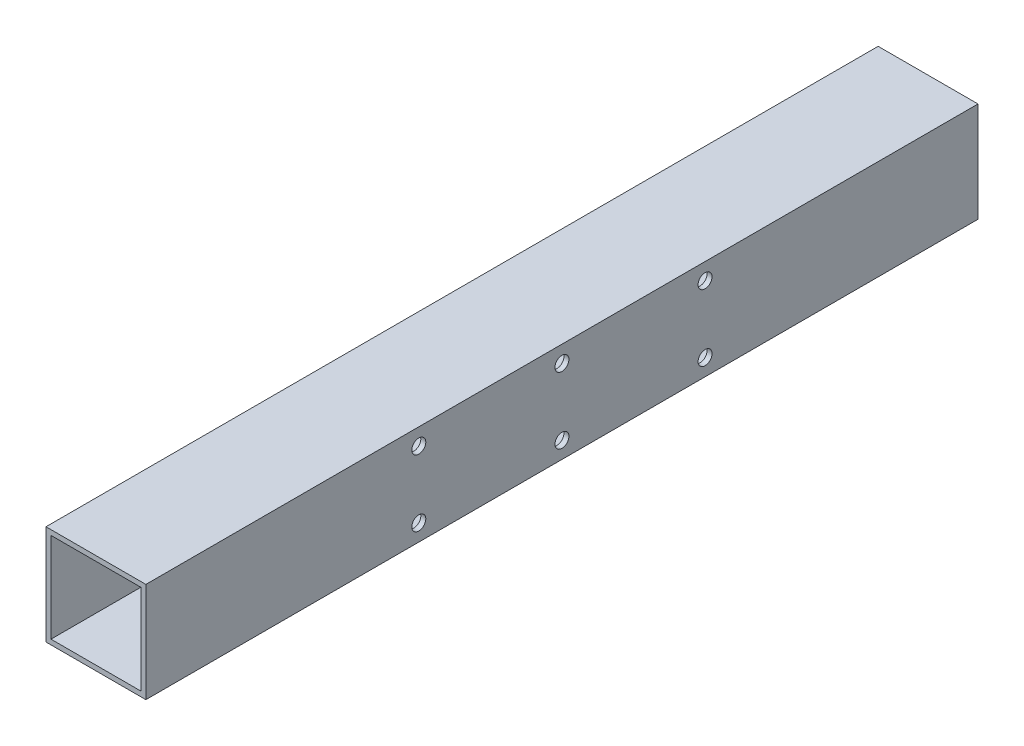
ISO-10303-21;
HEADER;
FILE_DESCRIPTION(('STEP AP214'),'2;1');
FILE_NAME('part.step','',(''),(''),'','','');
FILE_SCHEMA(('AUTOMOTIVE_DESIGN { 1 0 10303 214 1 1 1 1 }'));
ENDSEC;
DATA;
#1=APPLICATION_CONTEXT('core data for automotive mechanical design processes');
#2=APPLICATION_PROTOCOL_DEFINITION('international standard','automotive_design',2000,#1);
#3=PRODUCT_CONTEXT('',#1,'mechanical');
#4=PRODUCT('Part','Part','',(#3));
#5=PRODUCT_RELATED_PRODUCT_CATEGORY('part','',(#4));
#6=PRODUCT_DEFINITION_FORMATION('','',#4);
#7=PRODUCT_DEFINITION_CONTEXT('part definition',#1,'design');
#8=PRODUCT_DEFINITION('design','',#6,#7);
#9=PRODUCT_DEFINITION_SHAPE('','',#8);
#10=(LENGTH_UNIT() NAMED_UNIT(*) SI_UNIT(.MILLI.,.METRE.));
#11=(NAMED_UNIT(*) PLANE_ANGLE_UNIT() SI_UNIT($,.RADIAN.));
#12=(NAMED_UNIT(*) SI_UNIT($,.STERADIAN.) SOLID_ANGLE_UNIT());
#13=UNCERTAINTY_MEASURE_WITH_UNIT(LENGTH_MEASURE(1.E-05),#10,'distance_accuracy_value','');
#14=(GEOMETRIC_REPRESENTATION_CONTEXT(3) GLOBAL_UNCERTAINTY_ASSIGNED_CONTEXT((#13)) GLOBAL_UNIT_ASSIGNED_CONTEXT((#10,
#11,#12)) REPRESENTATION_CONTEXT('',''));
#15=CARTESIAN_POINT('',(0.,0.,0.));
#16=DIRECTION('',(0.,0.,1.));
#17=DIRECTION('',(1.,0.,0.));
#18=AXIS2_PLACEMENT_3D('',#15,#16,#17);
#19=CARTESIAN_POINT('',(0.,0.,250.));
#20=DIRECTION('',(0.,0.,-1.));
#21=DIRECTION('',(-1.,0.,0.));
#22=AXIS2_PLACEMENT_3D('',#19,#20,#21);
#23=PLANE('',#22);
#24=DIRECTION('',(0.,-1.,0.));
#25=VECTOR('',#24,1.);
#26=CARTESIAN_POINT('',(0.,0.,250.));
#27=LINE('',#26,#25);
#28=CARTESIAN_POINT('',(0.,30.,250.));
#29=VERTEX_POINT('',#28);
#30=CARTESIAN_POINT('',(0.,0.,250.));
#31=VERTEX_POINT('',#30);
#32=EDGE_CURVE('E150',#29,#31,#27,.T.);
#33=ORIENTED_EDGE('',*,*,#32,.T.);
#34=DIRECTION('',(1.,0.,0.));
#35=VECTOR('',#34,1.);
#36=CARTESIAN_POINT('',(0.,0.,250.));
#37=LINE('',#36,#35);
#38=CARTESIAN_POINT('',(30.,0.,250.));
#39=VERTEX_POINT('',#38);
#40=EDGE_CURVE('E153',#31,#39,#37,.T.);
#41=ORIENTED_EDGE('',*,*,#40,.T.);
#42=DIRECTION('',(0.,1.,0.));
#43=VECTOR('',#42,1.);
#44=CARTESIAN_POINT('',(30.,0.,250.));
#45=LINE('',#44,#43);
#46=CARTESIAN_POINT('',(30.,30.,250.));
#47=VERTEX_POINT('',#46);
#48=EDGE_CURVE('E156',#39,#47,#45,.T.);
#49=ORIENTED_EDGE('',*,*,#48,.T.);
#50=DIRECTION('',(-1.,0.,0.));
#51=VECTOR('',#50,1.);
#52=CARTESIAN_POINT('',(0.,30.,250.));
#53=LINE('',#52,#51);
#54=EDGE_CURVE('E158',#47,#29,#53,.T.);
#55=ORIENTED_EDGE('',*,*,#54,.T.);
#56=EDGE_LOOP('',(#33,#41,#49,#55));
#57=FACE_BOUND('',#56,.T.);
#58=DIRECTION('',(0.,-1.,0.));
#59=VECTOR('',#58,1.);
#60=CARTESIAN_POINT('',(1.5,1.5,250.));
#61=LINE('',#60,#59);
#62=CARTESIAN_POINT('',(1.5,28.5,250.));
#63=VERTEX_POINT('',#62);
#64=CARTESIAN_POINT('',(1.5,1.5,250.));
#65=VERTEX_POINT('',#64);
#66=EDGE_CURVE('E112',#63,#65,#61,.T.);
#67=ORIENTED_EDGE('',*,*,#66,.F.);
#68=DIRECTION('',(-1.,0.,0.));
#69=VECTOR('',#68,1.);
#70=CARTESIAN_POINT('',(1.5,28.5,250.));
#71=LINE('',#70,#69);
#72=CARTESIAN_POINT('',(28.5,28.5,250.));
#73=VERTEX_POINT('',#72);
#74=EDGE_CURVE('E134',#73,#63,#71,.T.);
#75=ORIENTED_EDGE('',*,*,#74,.F.);
#76=DIRECTION('',(0.,1.,0.));
#77=VECTOR('',#76,1.);
#78=CARTESIAN_POINT('',(28.5,1.5,250.));
#79=LINE('',#78,#77);
#80=CARTESIAN_POINT('',(28.5,1.5,250.));
#81=VERTEX_POINT('',#80);
#82=EDGE_CURVE('E132',#81,#73,#79,.T.);
#83=ORIENTED_EDGE('',*,*,#82,.F.);
#84=DIRECTION('',(1.,0.,0.));
#85=VECTOR('',#84,1.);
#86=CARTESIAN_POINT('',(1.5,1.5,250.));
#87=LINE('',#86,#85);
#88=EDGE_CURVE('E120',#65,#81,#87,.T.);
#89=ORIENTED_EDGE('',*,*,#88,.F.);
#90=EDGE_LOOP('',(#67,#75,#83,#89));
#91=FACE_BOUND('',#90,.T.);
#92=ADVANCED_FACE('F45',(#57,#91),#23,.F.);
#93=CARTESIAN_POINT('',(0.,0.,0.));
#94=DIRECTION('',(0.,0.,-1.));
#95=DIRECTION('',(-1.,0.,0.));
#96=AXIS2_PLACEMENT_3D('',#93,#94,#95);
#97=PLANE('',#96);
#98=DIRECTION('',(0.,-1.,0.));
#99=VECTOR('',#98,1.);
#100=CARTESIAN_POINT('',(0.,0.,0.));
#101=LINE('',#100,#99);
#102=CARTESIAN_POINT('',(0.,30.,0.));
#103=VERTEX_POINT('',#102);
#104=CARTESIAN_POINT('',(0.,0.,0.));
#105=VERTEX_POINT('',#104);
#106=EDGE_CURVE('E128',#103,#105,#101,.T.);
#107=ORIENTED_EDGE('',*,*,#106,.F.);
#108=DIRECTION('',(-1.,0.,0.));
#109=VECTOR('',#108,1.);
#110=CARTESIAN_POINT('',(0.,30.,0.));
#111=LINE('',#110,#109);
#112=CARTESIAN_POINT('',(30.,30.,0.));
#113=VERTEX_POINT('',#112);
#114=EDGE_CURVE('E154',#113,#103,#111,.T.);
#115=ORIENTED_EDGE('',*,*,#114,.F.);
#116=DIRECTION('',(0.,1.,0.));
#117=VECTOR('',#116,1.);
#118=CARTESIAN_POINT('',(30.,0.,0.));
#119=LINE('',#118,#117);
#120=CARTESIAN_POINT('',(30.,0.,0.));
#121=VERTEX_POINT('',#120);
#122=EDGE_CURVE('E165',#121,#113,#119,.T.);
#123=ORIENTED_EDGE('',*,*,#122,.F.);
#124=DIRECTION('',(1.,0.,0.));
#125=VECTOR('',#124,1.);
#126=CARTESIAN_POINT('',(0.,0.,0.));
#127=LINE('',#126,#125);
#128=EDGE_CURVE('E163',#105,#121,#127,.T.);
#129=ORIENTED_EDGE('',*,*,#128,.F.);
#130=EDGE_LOOP('',(#107,#115,#123,#129));
#131=FACE_BOUND('',#130,.T.);
#132=DIRECTION('',(-1.,0.,0.));
#133=VECTOR('',#132,1.);
#134=CARTESIAN_POINT('',(1.5,28.5,0.));
#135=LINE('',#134,#133);
#136=CARTESIAN_POINT('',(28.5,28.5,0.));
#137=VERTEX_POINT('',#136);
#138=CARTESIAN_POINT('',(1.5,28.5,0.));
#139=VERTEX_POINT('',#138);
#140=EDGE_CURVE('E121',#137,#139,#135,.T.);
#141=ORIENTED_EDGE('',*,*,#140,.T.);
#142=DIRECTION('',(0.,-1.,0.));
#143=VECTOR('',#142,1.);
#144=CARTESIAN_POINT('',(1.5,1.5,0.));
#145=LINE('',#144,#143);
#146=CARTESIAN_POINT('',(1.5,1.5,0.));
#147=VERTEX_POINT('',#146);
#148=EDGE_CURVE('E70',#139,#147,#145,.T.);
#149=ORIENTED_EDGE('',*,*,#148,.T.);
#150=DIRECTION('',(1.,0.,0.));
#151=VECTOR('',#150,1.);
#152=CARTESIAN_POINT('',(1.5,1.5,0.));
#153=LINE('',#152,#151);
#154=CARTESIAN_POINT('',(28.5,1.5,0.));
#155=VERTEX_POINT('',#154);
#156=EDGE_CURVE('E127',#147,#155,#153,.T.);
#157=ORIENTED_EDGE('',*,*,#156,.T.);
#158=DIRECTION('',(0.,1.,0.));
#159=VECTOR('',#158,1.);
#160=CARTESIAN_POINT('',(28.5,1.5,0.));
#161=LINE('',#160,#159);
#162=EDGE_CURVE('E142',#155,#137,#161,.T.);
#163=ORIENTED_EDGE('',*,*,#162,.T.);
#164=EDGE_LOOP('',(#141,#149,#157,#163));
#165=FACE_BOUND('',#164,.T.);
#166=ADVANCED_FACE('F229',(#131,#165),#97,.T.);
#167=CARTESIAN_POINT('',(0.,0.,250.));
#168=DIRECTION('',(1.,0.,0.));
#169=DIRECTION('',(0.,0.,-1.));
#170=AXIS2_PLACEMENT_3D('',#167,#168,#169);
#171=PLANE('',#170);
#172=CARTESIAN_POINT('',(0.,4.99999999999997,82.));
#173=DIRECTION('',(-1.,0.,0.));
#174=DIRECTION('',(0.,0.,1.));
#175=AXIS2_PLACEMENT_3D('',#172,#173,#174);
#176=CIRCLE('',#175,2.1);
#177=CARTESIAN_POINT('',(0.,4.99999999999997,84.1));
#178=VERTEX_POINT('',#177);
#179=EDGE_CURVE('E283',#178,#178,#176,.T.);
#180=ORIENTED_EDGE('',*,*,#179,.F.);
#181=EDGE_LOOP('',(#180));
#182=FACE_BOUND('',#181,.T.);
#183=CARTESIAN_POINT('',(0.,4.99999999999997,168.));
#184=DIRECTION('',(-1.,0.,0.));
#185=DIRECTION('',(0.,0.,1.));
#186=AXIS2_PLACEMENT_3D('',#183,#184,#185);
#187=CIRCLE('',#186,2.09999999999999);
#188=CARTESIAN_POINT('',(0.,4.99999999999997,170.1));
#189=VERTEX_POINT('',#188);
#190=EDGE_CURVE('E287',#189,#189,#187,.T.);
#191=ORIENTED_EDGE('',*,*,#190,.F.);
#192=EDGE_LOOP('',(#191));
#193=FACE_BOUND('',#192,.T.);
#194=CARTESIAN_POINT('',(0.,25.,168.));
#195=DIRECTION('',(-1.,0.,0.));
#196=DIRECTION('',(0.,0.,1.));
#197=AXIS2_PLACEMENT_3D('',#194,#195,#196);
#198=CIRCLE('',#197,2.09999999999999);
#199=CARTESIAN_POINT('',(0.,25.,170.1));
#200=VERTEX_POINT('',#199);
#201=EDGE_CURVE('E291',#200,#200,#198,.T.);
#202=ORIENTED_EDGE('',*,*,#201,.F.);
#203=EDGE_LOOP('',(#202));
#204=FACE_BOUND('',#203,.T.);
#205=CARTESIAN_POINT('',(0.,4.99999999999997,125.));
#206=DIRECTION('',(-1.,0.,0.));
#207=DIRECTION('',(0.,0.,1.));
#208=AXIS2_PLACEMENT_3D('',#205,#206,#207);
#209=CIRCLE('',#208,2.09999999999999);
#210=CARTESIAN_POINT('',(0.,4.99999999999997,127.1));
#211=VERTEX_POINT('',#210);
#212=EDGE_CURVE('E295',#211,#211,#209,.T.);
#213=ORIENTED_EDGE('',*,*,#212,.F.);
#214=EDGE_LOOP('',(#213));
#215=FACE_BOUND('',#214,.T.);
#216=CARTESIAN_POINT('',(0.,25.,82.));
#217=DIRECTION('',(-1.,0.,0.));
#218=DIRECTION('',(0.,0.,1.));
#219=AXIS2_PLACEMENT_3D('',#216,#217,#218);
#220=CIRCLE('',#219,2.1);
#221=CARTESIAN_POINT('',(0.,25.,84.1));
#222=VERTEX_POINT('',#221);
#223=EDGE_CURVE('E299',#222,#222,#220,.T.);
#224=ORIENTED_EDGE('',*,*,#223,.F.);
#225=EDGE_LOOP('',(#224));
#226=FACE_BOUND('',#225,.T.);
#227=CARTESIAN_POINT('',(0.,25.,125.));
#228=DIRECTION('',(-1.,0.,0.));
#229=DIRECTION('',(0.,0.,1.));
#230=AXIS2_PLACEMENT_3D('',#227,#228,#229);
#231=CIRCLE('',#230,2.09999999999999);
#232=CARTESIAN_POINT('',(0.,25.,127.1));
#233=VERTEX_POINT('',#232);
#234=EDGE_CURVE('E302',#233,#233,#231,.T.);
#235=ORIENTED_EDGE('',*,*,#234,.F.);
#236=EDGE_LOOP('',(#235));
#237=FACE_BOUND('',#236,.T.);
#238=ORIENTED_EDGE('',*,*,#106,.T.);
#239=DIRECTION('',(0.,0.,-1.));
#240=VECTOR('',#239,1.);
#241=CARTESIAN_POINT('',(0.,0.,250.));
#242=LINE('',#241,#240);
#243=EDGE_CURVE('E11',#31,#105,#242,.T.);
#244=ORIENTED_EDGE('',*,*,#243,.F.);
#245=ORIENTED_EDGE('',*,*,#32,.F.);
#246=DIRECTION('',(0.,0.,-1.));
#247=VECTOR('',#246,1.);
#248=CARTESIAN_POINT('',(0.,30.,250.));
#249=LINE('',#248,#247);
#250=EDGE_CURVE('E160',#29,#103,#249,.T.);
#251=ORIENTED_EDGE('',*,*,#250,.T.);
#252=EDGE_LOOP('',(#238,#244,#245,#251));
#253=FACE_BOUND('',#252,.T.);
#254=ADVANCED_FACE('F47',(#182,#193,#204,#215,#226,#237,#253),#171,.F.);
#255=CARTESIAN_POINT('',(0.,0.,250.));
#256=DIRECTION('',(0.,1.,0.));
#257=DIRECTION('',(0.,0.,1.));
#258=AXIS2_PLACEMENT_3D('',#255,#256,#257);
#259=PLANE('',#258);
#260=ORIENTED_EDGE('',*,*,#128,.T.);
#261=DIRECTION('',(0.,0.,-1.));
#262=VECTOR('',#261,1.);
#263=CARTESIAN_POINT('',(30.,0.,250.));
#264=LINE('',#263,#262);
#265=EDGE_CURVE('E54',#39,#121,#264,.T.);
#266=ORIENTED_EDGE('',*,*,#265,.F.);
#267=ORIENTED_EDGE('',*,*,#40,.F.);
#268=ORIENTED_EDGE('',*,*,#243,.T.);
#269=EDGE_LOOP('',(#260,#266,#267,#268));
#270=FACE_BOUND('',#269,.T.);
#271=ADVANCED_FACE('F259',(#270),#259,.F.);
#272=CARTESIAN_POINT('',(30.,0.,250.));
#273=DIRECTION('',(-1.,0.,0.));
#274=DIRECTION('',(0.,0.,1.));
#275=AXIS2_PLACEMENT_3D('',#272,#273,#274);
#276=PLANE('',#275);
#277=CARTESIAN_POINT('',(30.,4.99999999999997,82.));
#278=DIRECTION('',(-1.,0.,0.));
#279=DIRECTION('',(0.,0.,1.));
#280=AXIS2_PLACEMENT_3D('',#277,#278,#279);
#281=CIRCLE('',#280,2.1);
#282=CARTESIAN_POINT('',(30.,4.99999999999997,84.1));
#283=VERTEX_POINT('',#282);
#284=EDGE_CURVE('E355',#283,#283,#281,.T.);
#285=ORIENTED_EDGE('',*,*,#284,.T.);
#286=EDGE_LOOP('',(#285));
#287=FACE_BOUND('',#286,.T.);
#288=CARTESIAN_POINT('',(30.,4.99999999999997,168.));
#289=DIRECTION('',(-1.,0.,0.));
#290=DIRECTION('',(0.,0.,1.));
#291=AXIS2_PLACEMENT_3D('',#288,#289,#290);
#292=CIRCLE('',#291,2.09999999999999);
#293=CARTESIAN_POINT('',(30.,4.99999999999997,170.1));
#294=VERTEX_POINT('',#293);
#295=EDGE_CURVE('E360',#294,#294,#292,.T.);
#296=ORIENTED_EDGE('',*,*,#295,.T.);
#297=EDGE_LOOP('',(#296));
#298=FACE_BOUND('',#297,.T.);
#299=CARTESIAN_POINT('',(30.,25.,168.));
#300=DIRECTION('',(-1.,0.,0.));
#301=DIRECTION('',(0.,0.,1.));
#302=AXIS2_PLACEMENT_3D('',#299,#300,#301);
#303=CIRCLE('',#302,2.09999999999999);
#304=CARTESIAN_POINT('',(30.,25.,170.1));
#305=VERTEX_POINT('',#304);
#306=EDGE_CURVE('E359',#305,#305,#303,.T.);
#307=ORIENTED_EDGE('',*,*,#306,.T.);
#308=EDGE_LOOP('',(#307));
#309=FACE_BOUND('',#308,.T.);
#310=CARTESIAN_POINT('',(30.,4.99999999999997,125.));
#311=DIRECTION('',(-1.,0.,0.));
#312=DIRECTION('',(0.,0.,1.));
#313=AXIS2_PLACEMENT_3D('',#310,#311,#312);
#314=CIRCLE('',#313,2.09999999999999);
#315=CARTESIAN_POINT('',(30.,4.99999999999997,127.1));
#316=VERTEX_POINT('',#315);
#317=EDGE_CURVE('E307',#316,#316,#314,.T.);
#318=ORIENTED_EDGE('',*,*,#317,.T.);
#319=EDGE_LOOP('',(#318));
#320=FACE_BOUND('',#319,.T.);
#321=CARTESIAN_POINT('',(30.,25.,82.));
#322=DIRECTION('',(-1.,0.,0.));
#323=DIRECTION('',(0.,0.,1.));
#324=AXIS2_PLACEMENT_3D('',#321,#322,#323);
#325=CIRCLE('',#324,2.1);
#326=CARTESIAN_POINT('',(30.,25.,84.1));
#327=VERTEX_POINT('',#326);
#328=EDGE_CURVE('E352',#327,#327,#325,.T.);
#329=ORIENTED_EDGE('',*,*,#328,.T.);
#330=EDGE_LOOP('',(#329));
#331=FACE_BOUND('',#330,.T.);
#332=CARTESIAN_POINT('',(30.,25.,125.));
#333=DIRECTION('',(-1.,0.,0.));
#334=DIRECTION('',(0.,0.,1.));
#335=AXIS2_PLACEMENT_3D('',#332,#333,#334);
#336=CIRCLE('',#335,2.09999999999999);
#337=CARTESIAN_POINT('',(30.,25.,127.1));
#338=VERTEX_POINT('',#337);
#339=EDGE_CURVE('E179',#338,#338,#336,.T.);
#340=ORIENTED_EDGE('',*,*,#339,.T.);
#341=EDGE_LOOP('',(#340));
#342=FACE_BOUND('',#341,.T.);
#343=ORIENTED_EDGE('',*,*,#122,.T.);
#344=DIRECTION('',(0.,0.,-1.));
#345=VECTOR('',#344,1.);
#346=CARTESIAN_POINT('',(30.,30.,250.));
#347=LINE('',#346,#345);
#348=EDGE_CURVE('E170',#47,#113,#347,.T.);
#349=ORIENTED_EDGE('',*,*,#348,.F.);
#350=ORIENTED_EDGE('',*,*,#48,.F.);
#351=ORIENTED_EDGE('',*,*,#265,.T.);
#352=EDGE_LOOP('',(#343,#349,#350,#351));
#353=FACE_BOUND('',#352,.T.);
#354=ADVANCED_FACE('F256',(#287,#298,#309,#320,#331,#342,#353),#276,.F.);
#355=CARTESIAN_POINT('',(0.,30.,250.));
#356=DIRECTION('',(0.,-1.,0.));
#357=DIRECTION('',(0.,0.,-1.));
#358=AXIS2_PLACEMENT_3D('',#355,#356,#357);
#359=PLANE('',#358);
#360=ORIENTED_EDGE('',*,*,#114,.T.);
#361=ORIENTED_EDGE('',*,*,#250,.F.);
#362=ORIENTED_EDGE('',*,*,#54,.F.);
#363=ORIENTED_EDGE('',*,*,#348,.T.);
#364=EDGE_LOOP('',(#360,#361,#362,#363));
#365=FACE_BOUND('',#364,.T.);
#366=ADVANCED_FACE('F253',(#365),#359,.F.);
#367=CARTESIAN_POINT('',(1.5,1.5,250.));
#368=DIRECTION('',(1.,0.,0.));
#369=DIRECTION('',(0.,0.,-1.));
#370=AXIS2_PLACEMENT_3D('',#367,#368,#369);
#371=PLANE('',#370);
#372=CARTESIAN_POINT('',(1.5,4.99999999999997,82.));
#373=DIRECTION('',(1.,0.,0.));
#374=DIRECTION('',(0.,0.,-1.));
#375=AXIS2_PLACEMENT_3D('',#372,#373,#374);
#376=CIRCLE('',#375,2.1);
#377=CARTESIAN_POINT('',(1.5,4.99999999999997,79.9));
#378=VERTEX_POINT('',#377);
#379=EDGE_CURVE('E140',#378,#378,#376,.T.);
#380=ORIENTED_EDGE('',*,*,#379,.F.);
#381=EDGE_LOOP('',(#380));
#382=FACE_BOUND('',#381,.T.);
#383=CARTESIAN_POINT('',(1.5,4.99999999999997,168.));
#384=DIRECTION('',(1.,0.,0.));
#385=DIRECTION('',(0.,0.,-1.));
#386=AXIS2_PLACEMENT_3D('',#383,#384,#385);
#387=CIRCLE('',#386,2.09999999999999);
#388=CARTESIAN_POINT('',(1.5,4.99999999999997,165.9));
#389=VERTEX_POINT('',#388);
#390=EDGE_CURVE('E193',#389,#389,#387,.T.);
#391=ORIENTED_EDGE('',*,*,#390,.F.);
#392=EDGE_LOOP('',(#391));
#393=FACE_BOUND('',#392,.T.);
#394=CARTESIAN_POINT('',(1.5,25.,168.));
#395=DIRECTION('',(1.,0.,0.));
#396=DIRECTION('',(0.,0.,-1.));
#397=AXIS2_PLACEMENT_3D('',#394,#395,#396);
#398=CIRCLE('',#397,2.09999999999999);
#399=CARTESIAN_POINT('',(1.5,25.,165.9));
#400=VERTEX_POINT('',#399);
#401=EDGE_CURVE('E190',#400,#400,#398,.T.);
#402=ORIENTED_EDGE('',*,*,#401,.F.);
#403=EDGE_LOOP('',(#402));
#404=FACE_BOUND('',#403,.T.);
#405=CARTESIAN_POINT('',(1.5,4.99999999999997,125.));
#406=DIRECTION('',(1.,0.,0.));
#407=DIRECTION('',(0.,0.,-1.));
#408=AXIS2_PLACEMENT_3D('',#405,#406,#407);
#409=CIRCLE('',#408,2.09999999999999);
#410=CARTESIAN_POINT('',(1.5,4.99999999999997,122.9));
#411=VERTEX_POINT('',#410);
#412=EDGE_CURVE('E187',#411,#411,#409,.T.);
#413=ORIENTED_EDGE('',*,*,#412,.F.);
#414=EDGE_LOOP('',(#413));
#415=FACE_BOUND('',#414,.T.);
#416=CARTESIAN_POINT('',(1.5,25.,82.));
#417=DIRECTION('',(1.,0.,0.));
#418=DIRECTION('',(0.,0.,-1.));
#419=AXIS2_PLACEMENT_3D('',#416,#417,#418);
#420=CIRCLE('',#419,2.1);
#421=CARTESIAN_POINT('',(1.5,25.,79.9));
#422=VERTEX_POINT('',#421);
#423=EDGE_CURVE('E183',#422,#422,#420,.T.);
#424=ORIENTED_EDGE('',*,*,#423,.F.);
#425=EDGE_LOOP('',(#424));
#426=FACE_BOUND('',#425,.T.);
#427=CARTESIAN_POINT('',(1.5,25.,125.));
#428=DIRECTION('',(1.,0.,0.));
#429=DIRECTION('',(0.,0.,-1.));
#430=AXIS2_PLACEMENT_3D('',#427,#428,#429);
#431=CIRCLE('',#430,2.09999999999999);
#432=CARTESIAN_POINT('',(1.5,25.,122.9));
#433=VERTEX_POINT('',#432);
#434=EDGE_CURVE('E178',#433,#433,#431,.T.);
#435=ORIENTED_EDGE('',*,*,#434,.F.);
#436=EDGE_LOOP('',(#435));
#437=FACE_BOUND('',#436,.T.);
#438=ORIENTED_EDGE('',*,*,#148,.F.);
#439=DIRECTION('',(0.,0.,-1.));
#440=VECTOR('',#439,1.);
#441=CARTESIAN_POINT('',(1.5,28.5,250.));
#442=LINE('',#441,#440);
#443=EDGE_CURVE('E116',#63,#139,#442,.T.);
#444=ORIENTED_EDGE('',*,*,#443,.F.);
#445=ORIENTED_EDGE('',*,*,#66,.T.);
#446=DIRECTION('',(0.,0.,-1.));
#447=VECTOR('',#446,1.);
#448=CARTESIAN_POINT('',(1.5,1.5,250.));
#449=LINE('',#448,#447);
#450=EDGE_CURVE('E115',#65,#147,#449,.T.);
#451=ORIENTED_EDGE('',*,*,#450,.T.);
#452=EDGE_LOOP('',(#438,#444,#445,#451));
#453=FACE_BOUND('',#452,.T.);
#454=ADVANCED_FACE('F114',(#382,#393,#404,#415,#426,#437,#453),#371,.T.);
#455=CARTESIAN_POINT('',(1.5,1.5,250.));
#456=DIRECTION('',(0.,1.,0.));
#457=DIRECTION('',(0.,0.,1.));
#458=AXIS2_PLACEMENT_3D('',#455,#456,#457);
#459=PLANE('',#458);
#460=ORIENTED_EDGE('',*,*,#156,.F.);
#461=ORIENTED_EDGE('',*,*,#450,.F.);
#462=ORIENTED_EDGE('',*,*,#88,.T.);
#463=DIRECTION('',(0.,0.,-1.));
#464=VECTOR('',#463,1.);
#465=CARTESIAN_POINT('',(28.5,1.5,250.));
#466=LINE('',#465,#464);
#467=EDGE_CURVE('E129',#81,#155,#466,.T.);
#468=ORIENTED_EDGE('',*,*,#467,.T.);
#469=EDGE_LOOP('',(#460,#461,#462,#468));
#470=FACE_BOUND('',#469,.T.);
#471=ADVANCED_FACE('F124',(#470),#459,.T.);
#472=CARTESIAN_POINT('',(28.5,1.5,250.));
#473=DIRECTION('',(-1.,0.,0.));
#474=DIRECTION('',(0.,-1.,0.));
#475=AXIS2_PLACEMENT_3D('',#472,#473,#474);
#476=PLANE('',#475);
#477=CARTESIAN_POINT('',(28.5,4.99999999999997,82.));
#478=DIRECTION('',(-1.,0.,0.));
#479=DIRECTION('',(0.,-1.,0.));
#480=AXIS2_PLACEMENT_3D('',#477,#478,#479);
#481=CIRCLE('',#480,2.1);
#482=CARTESIAN_POINT('',(28.5,2.89999999999996,82.));
#483=VERTEX_POINT('',#482);
#484=EDGE_CURVE('E49',#483,#483,#481,.T.);
#485=ORIENTED_EDGE('',*,*,#484,.F.);
#486=EDGE_LOOP('',(#485));
#487=FACE_BOUND('',#486,.T.);
#488=CARTESIAN_POINT('',(28.5,4.99999999999997,168.));
#489=DIRECTION('',(-1.,0.,0.));
#490=DIRECTION('',(0.,-1.,0.));
#491=AXIS2_PLACEMENT_3D('',#488,#489,#490);
#492=CIRCLE('',#491,2.09999999999999);
#493=CARTESIAN_POINT('',(28.5,2.89999999999998,168.));
#494=VERTEX_POINT('',#493);
#495=EDGE_CURVE('E191',#494,#494,#492,.T.);
#496=ORIENTED_EDGE('',*,*,#495,.F.);
#497=EDGE_LOOP('',(#496));
#498=FACE_BOUND('',#497,.T.);
#499=CARTESIAN_POINT('',(28.5,25.,168.));
#500=DIRECTION('',(-1.,0.,0.));
#501=DIRECTION('',(0.,-1.,0.));
#502=AXIS2_PLACEMENT_3D('',#499,#500,#501);
#503=CIRCLE('',#502,2.09999999999999);
#504=CARTESIAN_POINT('',(28.5,22.9,168.));
#505=VERTEX_POINT('',#504);
#506=EDGE_CURVE('E188',#505,#505,#503,.T.);
#507=ORIENTED_EDGE('',*,*,#506,.F.);
#508=EDGE_LOOP('',(#507));
#509=FACE_BOUND('',#508,.T.);
#510=CARTESIAN_POINT('',(28.5,4.99999999999997,125.));
#511=DIRECTION('',(-1.,0.,0.));
#512=DIRECTION('',(0.,-1.,0.));
#513=AXIS2_PLACEMENT_3D('',#510,#511,#512);
#514=CIRCLE('',#513,2.09999999999999);
#515=CARTESIAN_POINT('',(28.5,2.89999999999998,125.));
#516=VERTEX_POINT('',#515);
#517=EDGE_CURVE('E184',#516,#516,#514,.T.);
#518=ORIENTED_EDGE('',*,*,#517,.F.);
#519=EDGE_LOOP('',(#518));
#520=FACE_BOUND('',#519,.T.);
#521=CARTESIAN_POINT('',(28.5,25.,82.));
#522=DIRECTION('',(-1.,0.,0.));
#523=DIRECTION('',(0.,-1.,0.));
#524=AXIS2_PLACEMENT_3D('',#521,#522,#523);
#525=CIRCLE('',#524,2.1);
#526=CARTESIAN_POINT('',(28.5,22.9,82.));
#527=VERTEX_POINT('',#526);
#528=EDGE_CURVE('E180',#527,#527,#525,.T.);
#529=ORIENTED_EDGE('',*,*,#528,.F.);
#530=EDGE_LOOP('',(#529));
#531=FACE_BOUND('',#530,.T.);
#532=CARTESIAN_POINT('',(28.5,25.,125.));
#533=DIRECTION('',(-1.,0.,0.));
#534=DIRECTION('',(0.,-1.,0.));
#535=AXIS2_PLACEMENT_3D('',#532,#533,#534);
#536=CIRCLE('',#535,2.09999999999999);
#537=CARTESIAN_POINT('',(28.5,22.9,125.));
#538=VERTEX_POINT('',#537);
#539=EDGE_CURVE('E175',#538,#538,#536,.T.);
#540=ORIENTED_EDGE('',*,*,#539,.F.);
#541=EDGE_LOOP('',(#540));
#542=FACE_BOUND('',#541,.T.);
#543=ORIENTED_EDGE('',*,*,#162,.F.);
#544=ORIENTED_EDGE('',*,*,#467,.F.);
#545=ORIENTED_EDGE('',*,*,#82,.T.);
#546=DIRECTION('',(0.,0.,-1.));
#547=VECTOR('',#546,1.);
#548=CARTESIAN_POINT('',(28.5,28.5,250.));
#549=LINE('',#548,#547);
#550=EDGE_CURVE('E62',#73,#137,#549,.T.);
#551=ORIENTED_EDGE('',*,*,#550,.T.);
#552=EDGE_LOOP('',(#543,#544,#545,#551));
#553=FACE_BOUND('',#552,.T.);
#554=ADVANCED_FACE('F213',(#487,#498,#509,#520,#531,#542,#553),#476,.T.);
#555=CARTESIAN_POINT('',(1.5,28.5,250.));
#556=DIRECTION('',(0.,-1.,0.));
#557=DIRECTION('',(0.,0.,-1.));
#558=AXIS2_PLACEMENT_3D('',#555,#556,#557);
#559=PLANE('',#558);
#560=ORIENTED_EDGE('',*,*,#140,.F.);
#561=ORIENTED_EDGE('',*,*,#550,.F.);
#562=ORIENTED_EDGE('',*,*,#74,.T.);
#563=ORIENTED_EDGE('',*,*,#443,.T.);
#564=EDGE_LOOP('',(#560,#561,#562,#563));
#565=FACE_BOUND('',#564,.T.);
#566=ADVANCED_FACE('F216',(#565),#559,.T.);
#567=CARTESIAN_POINT('',(30.,25.,125.));
#568=DIRECTION('',(-1.,0.,0.));
#569=DIRECTION('',(0.,0.,1.));
#570=AXIS2_PLACEMENT_3D('',#567,#568,#569);
#571=CYLINDRICAL_SURFACE('',#570,2.09999999999999);
#572=ORIENTED_EDGE('',*,*,#539,.T.);
#573=EDGE_LOOP('',(#572));
#574=FACE_BOUND('',#573,.T.);
#575=ORIENTED_EDGE('',*,*,#339,.F.);
#576=EDGE_LOOP('',(#575));
#577=FACE_BOUND('',#576,.T.);
#578=ADVANCED_FACE('F231',(#574,#577),#571,.F.);
#579=CARTESIAN_POINT('',(30.,25.,82.));
#580=DIRECTION('',(-1.,0.,0.));
#581=DIRECTION('',(0.,0.,1.));
#582=AXIS2_PLACEMENT_3D('',#579,#580,#581);
#583=CYLINDRICAL_SURFACE('',#582,2.1);
#584=ORIENTED_EDGE('',*,*,#528,.T.);
#585=EDGE_LOOP('',(#584));
#586=FACE_BOUND('',#585,.T.);
#587=ORIENTED_EDGE('',*,*,#328,.F.);
#588=EDGE_LOOP('',(#587));
#589=FACE_BOUND('',#588,.T.);
#590=ADVANCED_FACE('F238',(#586,#589),#583,.F.);
#591=CARTESIAN_POINT('',(30.,4.99999999999997,125.));
#592=DIRECTION('',(-1.,0.,0.));
#593=DIRECTION('',(0.,0.,1.));
#594=AXIS2_PLACEMENT_3D('',#591,#592,#593);
#595=CYLINDRICAL_SURFACE('',#594,2.09999999999999);
#596=ORIENTED_EDGE('',*,*,#517,.T.);
#597=EDGE_LOOP('',(#596));
#598=FACE_BOUND('',#597,.T.);
#599=ORIENTED_EDGE('',*,*,#317,.F.);
#600=EDGE_LOOP('',(#599));
#601=FACE_BOUND('',#600,.T.);
#602=ADVANCED_FACE('F337',(#598,#601),#595,.F.);
#603=CARTESIAN_POINT('',(30.,25.,168.));
#604=DIRECTION('',(-1.,0.,0.));
#605=DIRECTION('',(0.,0.,1.));
#606=AXIS2_PLACEMENT_3D('',#603,#604,#605);
#607=CYLINDRICAL_SURFACE('',#606,2.09999999999999);
#608=ORIENTED_EDGE('',*,*,#506,.T.);
#609=EDGE_LOOP('',(#608));
#610=FACE_BOUND('',#609,.T.);
#611=ORIENTED_EDGE('',*,*,#306,.F.);
#612=EDGE_LOOP('',(#611));
#613=FACE_BOUND('',#612,.T.);
#614=ADVANCED_FACE('F334',(#610,#613),#607,.F.);
#615=CARTESIAN_POINT('',(30.,4.99999999999997,168.));
#616=DIRECTION('',(-1.,0.,0.));
#617=DIRECTION('',(0.,0.,1.));
#618=AXIS2_PLACEMENT_3D('',#615,#616,#617);
#619=CYLINDRICAL_SURFACE('',#618,2.09999999999999);
#620=ORIENTED_EDGE('',*,*,#495,.T.);
#621=EDGE_LOOP('',(#620));
#622=FACE_BOUND('',#621,.T.);
#623=ORIENTED_EDGE('',*,*,#295,.F.);
#624=EDGE_LOOP('',(#623));
#625=FACE_BOUND('',#624,.T.);
#626=ADVANCED_FACE('F330',(#622,#625),#619,.F.);
#627=CARTESIAN_POINT('',(30.,4.99999999999997,82.));
#628=DIRECTION('',(-1.,0.,0.));
#629=DIRECTION('',(0.,0.,1.));
#630=AXIS2_PLACEMENT_3D('',#627,#628,#629);
#631=CYLINDRICAL_SURFACE('',#630,2.1);
#632=ORIENTED_EDGE('',*,*,#484,.T.);
#633=EDGE_LOOP('',(#632));
#634=FACE_BOUND('',#633,.T.);
#635=ORIENTED_EDGE('',*,*,#284,.F.);
#636=EDGE_LOOP('',(#635));
#637=FACE_BOUND('',#636,.T.);
#638=ADVANCED_FACE('F210',(#634,#637),#631,.F.);
#639=ORIENTED_EDGE('',*,*,#434,.T.);
#640=EDGE_LOOP('',(#639));
#641=FACE_BOUND('',#640,.T.);
#642=ORIENTED_EDGE('',*,*,#234,.T.);
#643=EDGE_LOOP('',(#642));
#644=FACE_BOUND('',#643,.T.);
#645=ADVANCED_FACE('F241',(#641,#644),#571,.F.);
#646=ORIENTED_EDGE('',*,*,#423,.T.);
#647=EDGE_LOOP('',(#646));
#648=FACE_BOUND('',#647,.T.);
#649=ORIENTED_EDGE('',*,*,#223,.T.);
#650=EDGE_LOOP('',(#649));
#651=FACE_BOUND('',#650,.T.);
#652=ADVANCED_FACE('F315',(#648,#651),#583,.F.);
#653=ORIENTED_EDGE('',*,*,#412,.T.);
#654=EDGE_LOOP('',(#653));
#655=FACE_BOUND('',#654,.T.);
#656=ORIENTED_EDGE('',*,*,#212,.T.);
#657=EDGE_LOOP('',(#656));
#658=FACE_BOUND('',#657,.T.);
#659=ADVANCED_FACE('F328',(#655,#658),#595,.F.);
#660=ORIENTED_EDGE('',*,*,#401,.T.);
#661=EDGE_LOOP('',(#660));
#662=FACE_BOUND('',#661,.T.);
#663=ORIENTED_EDGE('',*,*,#201,.T.);
#664=EDGE_LOOP('',(#663));
#665=FACE_BOUND('',#664,.T.);
#666=ADVANCED_FACE('F339',(#662,#665),#607,.F.);
#667=ORIENTED_EDGE('',*,*,#390,.T.);
#668=EDGE_LOOP('',(#667));
#669=FACE_BOUND('',#668,.T.);
#670=ORIENTED_EDGE('',*,*,#190,.T.);
#671=EDGE_LOOP('',(#670));
#672=FACE_BOUND('',#671,.T.);
#673=ADVANCED_FACE('F344',(#669,#672),#619,.F.);
#674=ORIENTED_EDGE('',*,*,#379,.T.);
#675=EDGE_LOOP('',(#674));
#676=FACE_BOUND('',#675,.T.);
#677=ORIENTED_EDGE('',*,*,#179,.T.);
#678=EDGE_LOOP('',(#677));
#679=FACE_BOUND('',#678,.T.);
#680=ADVANCED_FACE('F332',(#676,#679),#631,.F.);
#681=CLOSED_SHELL('',(#92,#166,#254,#271,#354,#366,#454,#471,#554,#566,#578,#590,#602,#614,#626,
#638,#645,#652,#659,#666,#673,#680));
#682=MANIFOLD_SOLID_BREP('B2',#681);
#683=ADVANCED_BREP_SHAPE_REPRESENTATION('',(#18,#682),#14);
#684=SHAPE_DEFINITION_REPRESENTATION(#9,#683);
ENDSEC;
END-ISO-10303-21;
